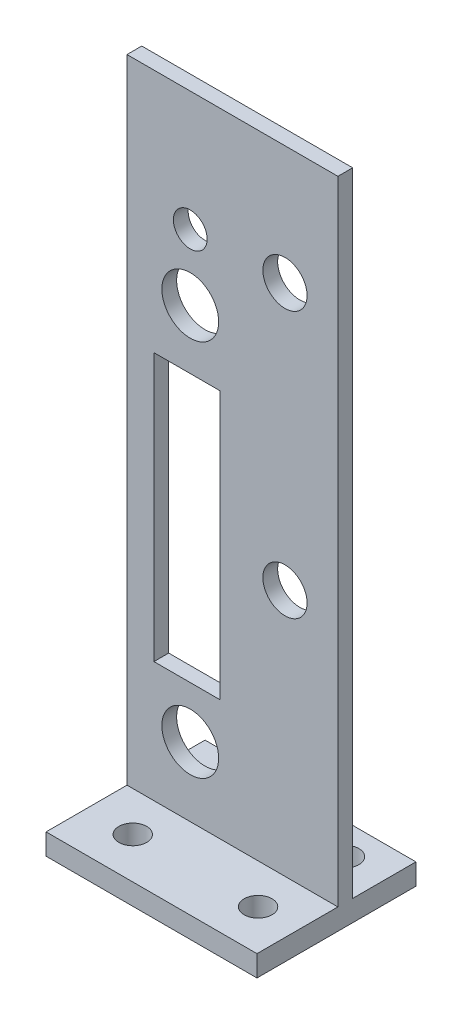
ISO-10303-21;
HEADER;
FILE_DESCRIPTION(('STEP AP214'),'2;1');
FILE_NAME('part.step','',(''),(''),'','','');
FILE_SCHEMA(('AUTOMOTIVE_DESIGN { 1 0 10303 214 1 1 1 1 }'));
ENDSEC;
DATA;
#1=APPLICATION_CONTEXT('core data for automotive mechanical design processes');
#2=APPLICATION_PROTOCOL_DEFINITION('international standard','automotive_design',2000,#1);
#3=PRODUCT_CONTEXT('',#1,'mechanical');
#4=PRODUCT('Part','Part','',(#3));
#5=PRODUCT_RELATED_PRODUCT_CATEGORY('part','',(#4));
#6=PRODUCT_DEFINITION_FORMATION('','',#4);
#7=PRODUCT_DEFINITION_CONTEXT('part definition',#1,'design');
#8=PRODUCT_DEFINITION('design','',#6,#7);
#9=PRODUCT_DEFINITION_SHAPE('','',#8);
#10=(LENGTH_UNIT() NAMED_UNIT(*) SI_UNIT(.MILLI.,.METRE.));
#11=(NAMED_UNIT(*) PLANE_ANGLE_UNIT() SI_UNIT($,.RADIAN.));
#12=(NAMED_UNIT(*) SI_UNIT($,.STERADIAN.) SOLID_ANGLE_UNIT());
#13=UNCERTAINTY_MEASURE_WITH_UNIT(LENGTH_MEASURE(1.E-05),#10,'distance_accuracy_value','');
#14=(GEOMETRIC_REPRESENTATION_CONTEXT(3) GLOBAL_UNCERTAINTY_ASSIGNED_CONTEXT((#13)) GLOBAL_UNIT_ASSIGNED_CONTEXT((#10,
#11,#12)) REPRESENTATION_CONTEXT('',''));
#15=CARTESIAN_POINT('',(0.,0.,0.));
#16=DIRECTION('',(0.,0.,1.));
#17=DIRECTION('',(1.,0.,0.));
#18=AXIS2_PLACEMENT_3D('',#15,#16,#17);
#19=CARTESIAN_POINT('',(-23.321554770318,41.8114649543858,3.5));
#20=DIRECTION('',(1.,0.,0.));
#21=DIRECTION('',(0.,1.,0.));
#22=AXIS2_PLACEMENT_3D('',#19,#20,#21);
#23=PLANE('',#22);
#24=DIRECTION('',(0.,-1.,0.));
#25=VECTOR('',#24,1.);
#26=CARTESIAN_POINT('',(-23.321554770318,41.8114649543858,0.));
#27=LINE('',#26,#25);
#28=CARTESIAN_POINT('',(-23.321554770318,41.8114649543858,0.));
#29=VERTEX_POINT('',#28);
#30=CARTESIAN_POINT('',(-23.321554770318,-108.188535045614,0.));
#31=VERTEX_POINT('',#30);
#32=EDGE_CURVE('E255',#29,#31,#27,.T.);
#33=ORIENTED_EDGE('',*,*,#32,.T.);
#34=DIRECTION('',(0.,0.,-1.));
#35=VECTOR('',#34,1.);
#36=CARTESIAN_POINT('',(-23.321554770318,-108.188535045614,0.));
#37=LINE('',#36,#35);
#38=CARTESIAN_POINT('',(-23.321554770318,-108.188535045614,-15.));
#39=VERTEX_POINT('',#38);
#40=EDGE_CURVE('E237',#31,#39,#37,.T.);
#41=ORIENTED_EDGE('',*,*,#40,.T.);
#42=DIRECTION('',(0.,1.,0.));
#43=VECTOR('',#42,1.);
#44=CARTESIAN_POINT('',(-23.321554770318,-113.188535045614,-15.));
#45=LINE('',#44,#43);
#46=CARTESIAN_POINT('',(-23.321554770318,-113.188535045614,-15.));
#47=VERTEX_POINT('',#46);
#48=EDGE_CURVE('E224',#47,#39,#45,.T.);
#49=ORIENTED_EDGE('',*,*,#48,.F.);
#50=DIRECTION('',(0.,0.,-1.));
#51=VECTOR('',#50,1.);
#52=CARTESIAN_POINT('',(-23.321554770318,-113.188535045614,0.));
#53=LINE('',#52,#51);
#54=CARTESIAN_POINT('',(-23.321554770318,-113.188535045614,22.6854790811748));
#55=VERTEX_POINT('',#54);
#56=EDGE_CURVE('E221',#55,#47,#53,.T.);
#57=ORIENTED_EDGE('',*,*,#56,.F.);
#58=DIRECTION('',(0.,1.,0.));
#59=VECTOR('',#58,1.);
#60=CARTESIAN_POINT('',(-23.321554770318,-113.188535045614,22.6854790811748));
#61=LINE('',#60,#59);
#62=CARTESIAN_POINT('',(-23.321554770318,-108.188535045614,22.6854790811748));
#63=VERTEX_POINT('',#62);
#64=EDGE_CURVE('E244',#55,#63,#61,.T.);
#65=ORIENTED_EDGE('',*,*,#64,.T.);
#66=CARTESIAN_POINT('',(-23.321554770318,-108.188535045614,3.5));
#67=VERTEX_POINT('',#66);
#68=EDGE_CURVE('E214',#63,#67,#37,.T.);
#69=ORIENTED_EDGE('',*,*,#68,.T.);
#70=DIRECTION('',(0.,-1.,0.));
#71=VECTOR('',#70,1.);
#72=CARTESIAN_POINT('',(-23.321554770318,41.8114649543858,3.5));
#73=LINE('',#72,#71);
#74=CARTESIAN_POINT('',(-23.321554770318,41.8114649543858,3.5));
#75=VERTEX_POINT('',#74);
#76=EDGE_CURVE('E256',#75,#67,#73,.T.);
#77=ORIENTED_EDGE('',*,*,#76,.F.);
#78=DIRECTION('',(0.,0.,-1.));
#79=VECTOR('',#78,1.);
#80=CARTESIAN_POINT('',(-23.321554770318,41.8114649543858,3.5));
#81=LINE('',#80,#79);
#82=EDGE_CURVE('E271',#75,#29,#81,.T.);
#83=ORIENTED_EDGE('',*,*,#82,.T.);
#84=EDGE_LOOP('',(#33,#41,#49,#57,#65,#69,#77,#83));
#85=FACE_BOUND('',#84,.T.);
#86=ADVANCED_FACE('F47',(#85),#23,.F.);
#87=CARTESIAN_POINT('',(26.678445229682,41.8114649543858,3.5));
#88=DIRECTION('',(-1.,0.,0.));
#89=DIRECTION('',(0.,-1.,0.));
#90=AXIS2_PLACEMENT_3D('',#87,#88,#89);
#91=PLANE('',#90);
#92=DIRECTION('',(0.,1.,0.));
#93=VECTOR('',#92,1.);
#94=CARTESIAN_POINT('',(26.678445229682,41.8114649543858,0.));
#95=LINE('',#94,#93);
#96=CARTESIAN_POINT('',(26.678445229682,-108.188535045614,0.));
#97=VERTEX_POINT('',#96);
#98=CARTESIAN_POINT('',(26.678445229682,41.8114649543858,0.));
#99=VERTEX_POINT('',#98);
#100=EDGE_CURVE('E278',#97,#99,#95,.T.);
#101=ORIENTED_EDGE('',*,*,#100,.T.);
#102=DIRECTION('',(0.,0.,-1.));
#103=VECTOR('',#102,1.);
#104=CARTESIAN_POINT('',(26.678445229682,41.8114649543858,3.5));
#105=LINE('',#104,#103);
#106=CARTESIAN_POINT('',(26.678445229682,41.8114649543858,3.5));
#107=VERTEX_POINT('',#106);
#108=EDGE_CURVE('E286',#107,#99,#105,.T.);
#109=ORIENTED_EDGE('',*,*,#108,.F.);
#110=DIRECTION('',(0.,1.,0.));
#111=VECTOR('',#110,1.);
#112=CARTESIAN_POINT('',(26.678445229682,41.8114649543858,3.5));
#113=LINE('',#112,#111);
#114=CARTESIAN_POINT('',(26.678445229682,-108.188535045614,3.5));
#115=VERTEX_POINT('',#114);
#116=EDGE_CURVE('E265',#115,#107,#113,.T.);
#117=ORIENTED_EDGE('',*,*,#116,.F.);
#118=DIRECTION('',(0.,0.,1.));
#119=VECTOR('',#118,1.);
#120=CARTESIAN_POINT('',(26.678445229682,-108.188535045614,0.));
#121=LINE('',#120,#119);
#122=CARTESIAN_POINT('',(26.678445229682,-108.188535045614,22.6854790811748));
#123=VERTEX_POINT('',#122);
#124=EDGE_CURVE('E228',#115,#123,#121,.T.);
#125=ORIENTED_EDGE('',*,*,#124,.T.);
#126=DIRECTION('',(0.,1.,0.));
#127=VECTOR('',#126,1.);
#128=CARTESIAN_POINT('',(26.678445229682,-113.188535045614,22.6854790811748));
#129=LINE('',#128,#127);
#130=CARTESIAN_POINT('',(26.678445229682,-113.188535045614,22.6854790811748));
#131=VERTEX_POINT('',#130);
#132=EDGE_CURVE('E247',#131,#123,#129,.T.);
#133=ORIENTED_EDGE('',*,*,#132,.F.);
#134=DIRECTION('',(0.,0.,1.));
#135=VECTOR('',#134,1.);
#136=CARTESIAN_POINT('',(26.678445229682,-113.188535045614,0.));
#137=LINE('',#136,#135);
#138=CARTESIAN_POINT('',(26.678445229682,-113.188535045614,-15.));
#139=VERTEX_POINT('',#138);
#140=EDGE_CURVE('E213',#139,#131,#137,.T.);
#141=ORIENTED_EDGE('',*,*,#140,.F.);
#142=DIRECTION('',(0.,1.,0.));
#143=VECTOR('',#142,1.);
#144=CARTESIAN_POINT('',(26.678445229682,-113.188535045614,-15.));
#145=LINE('',#144,#143);
#146=CARTESIAN_POINT('',(26.678445229682,-108.188535045614,-15.));
#147=VERTEX_POINT('',#146);
#148=EDGE_CURVE('E251',#139,#147,#145,.T.);
#149=ORIENTED_EDGE('',*,*,#148,.T.);
#150=EDGE_CURVE('E229',#147,#97,#121,.T.);
#151=ORIENTED_EDGE('',*,*,#150,.T.);
#152=EDGE_LOOP('',(#101,#109,#117,#125,#133,#141,#149,#151));
#153=FACE_BOUND('',#152,.T.);
#154=ADVANCED_FACE('F363',(#153),#91,.F.);
#155=CARTESIAN_POINT('',(-23.321554770318,41.8114649543858,3.5));
#156=DIRECTION('',(0.,-1.,0.));
#157=DIRECTION('',(0.,0.,-1.));
#158=AXIS2_PLACEMENT_3D('',#155,#156,#157);
#159=PLANE('',#158);
#160=DIRECTION('',(-1.,0.,0.));
#161=VECTOR('',#160,1.);
#162=CARTESIAN_POINT('',(-23.321554770318,41.8114649543858,0.));
#163=LINE('',#162,#161);
#164=EDGE_CURVE('E261',#99,#29,#163,.T.);
#165=ORIENTED_EDGE('',*,*,#164,.T.);
#166=ORIENTED_EDGE('',*,*,#82,.F.);
#167=DIRECTION('',(-1.,0.,0.));
#168=VECTOR('',#167,1.);
#169=CARTESIAN_POINT('',(-23.321554770318,41.8114649543858,3.5));
#170=LINE('',#169,#168);
#171=EDGE_CURVE('E268',#107,#75,#170,.T.);
#172=ORIENTED_EDGE('',*,*,#171,.F.);
#173=ORIENTED_EDGE('',*,*,#108,.T.);
#174=EDGE_LOOP('',(#165,#166,#172,#173));
#175=FACE_BOUND('',#174,.T.);
#176=ADVANCED_FACE('F359',(#175),#159,.F.);
#177=CARTESIAN_POINT('',(0.,0.,3.5));
#178=DIRECTION('',(0.,0.,1.));
#179=DIRECTION('',(1.,0.,0.));
#180=AXIS2_PLACEMENT_3D('',#177,#178,#179);
#181=PLANE('',#180);
#182=CARTESIAN_POINT('',(14.135684742779,13.6491774901224,3.5));
#183=DIRECTION('',(0.,0.,1.));
#184=DIRECTION('',(1.,0.,0.));
#185=AXIS2_PLACEMENT_3D('',#182,#183,#184);
#186=CIRCLE('',#185,5.24);
#187=CARTESIAN_POINT('',(19.375684742779,13.6491774901224,3.5));
#188=VERTEX_POINT('',#187);
#189=EDGE_CURVE('E313',#188,#188,#186,.T.);
#190=ORIENTED_EDGE('',*,*,#189,.F.);
#191=EDGE_LOOP('',(#190));
#192=FACE_BOUND('',#191,.T.);
#193=CARTESIAN_POINT('',(14.135684742779,-49.4627558763849,3.5));
#194=DIRECTION('',(0.,0.,1.));
#195=DIRECTION('',(1.,0.,0.));
#196=AXIS2_PLACEMENT_3D('',#193,#194,#195);
#197=CIRCLE('',#196,5.24);
#198=CARTESIAN_POINT('',(19.375684742779,-49.4627558763849,3.5));
#199=VERTEX_POINT('',#198);
#200=EDGE_CURVE('E320',#199,#199,#197,.T.);
#201=ORIENTED_EDGE('',*,*,#200,.F.);
#202=EDGE_LOOP('',(#201));
#203=FACE_BOUND('',#202,.T.);
#204=CARTESIAN_POINT('',(-8.32155477031803,-91.8029962411796,3.5));
#205=DIRECTION('',(0.,0.,1.));
#206=DIRECTION('',(1.,0.,0.));
#207=AXIS2_PLACEMENT_3D('',#204,#205,#206);
#208=CIRCLE('',#207,6.731);
#209=CARTESIAN_POINT('',(-1.59055477031803,-91.8029962411796,3.5));
#210=VERTEX_POINT('',#209);
#211=EDGE_CURVE('E167',#210,#210,#208,.T.);
#212=ORIENTED_EDGE('',*,*,#211,.F.);
#213=EDGE_LOOP('',(#212));
#214=FACE_BOUND('',#213,.T.);
#215=CARTESIAN_POINT('',(-8.32155477031803,-2.20299624117957,3.5));
#216=DIRECTION('',(0.,0.,1.));
#217=DIRECTION('',(1.,0.,0.));
#218=AXIS2_PLACEMENT_3D('',#215,#216,#217);
#219=CIRCLE('',#218,6.731);
#220=CARTESIAN_POINT('',(-1.59055477031803,-2.20299624117957,3.5));
#221=VERTEX_POINT('',#220);
#222=EDGE_CURVE('E162',#221,#221,#219,.T.);
#223=ORIENTED_EDGE('',*,*,#222,.F.);
#224=EDGE_LOOP('',(#223));
#225=FACE_BOUND('',#224,.T.);
#226=DIRECTION('',(0.,-1.,0.));
#227=VECTOR('',#226,1.);
#228=CARTESIAN_POINT('',(-16.9306567073099,-16.1959114515281,3.5));
#229=LINE('',#228,#227);
#230=CARTESIAN_POINT('',(-16.9306567073099,-16.1959114515281,3.5));
#231=VERTEX_POINT('',#230);
#232=CARTESIAN_POINT('',(-16.9306567073099,-79.6261951335017,3.5));
#233=VERTEX_POINT('',#232);
#234=EDGE_CURVE('E64',#231,#233,#229,.T.);
#235=ORIENTED_EDGE('',*,*,#234,.F.);
#236=DIRECTION('',(-1.,0.,0.));
#237=VECTOR('',#236,1.);
#238=CARTESIAN_POINT('',(-16.9306567073099,-16.1959114515281,3.5));
#239=LINE('',#238,#237);
#240=CARTESIAN_POINT('',(-1.24340443109602,-16.1959114515281,3.5));
#241=VERTEX_POINT('',#240);
#242=EDGE_CURVE('E147',#241,#231,#239,.T.);
#243=ORIENTED_EDGE('',*,*,#242,.F.);
#244=DIRECTION('',(0.,1.,0.));
#245=VECTOR('',#244,1.);
#246=CARTESIAN_POINT('',(-1.24340443109602,-16.1959114515281,3.5));
#247=LINE('',#246,#245);
#248=CARTESIAN_POINT('',(-1.24340443109602,-79.6261951335017,3.5));
#249=VERTEX_POINT('',#248);
#250=EDGE_CURVE('E154',#249,#241,#247,.T.);
#251=ORIENTED_EDGE('',*,*,#250,.F.);
#252=DIRECTION('',(1.,0.,0.));
#253=VECTOR('',#252,1.);
#254=CARTESIAN_POINT('',(-16.9306567073099,-79.6261951335017,3.5));
#255=LINE('',#254,#253);
#256=EDGE_CURVE('E160',#233,#249,#255,.T.);
#257=ORIENTED_EDGE('',*,*,#256,.F.);
#258=EDGE_LOOP('',(#235,#243,#251,#257));
#259=FACE_BOUND('',#258,.T.);
#260=CARTESIAN_POINT('',(-8.32155477031803,13.3970037588204,3.5));
#261=DIRECTION('',(0.,0.,1.));
#262=DIRECTION('',(1.,0.,0.));
#263=AXIS2_PLACEMENT_3D('',#260,#261,#262);
#264=CIRCLE('',#263,4.);
#265=CARTESIAN_POINT('',(-4.32155477031803,13.3970037588204,3.5));
#266=VERTEX_POINT('',#265);
#267=EDGE_CURVE('E144',#266,#266,#264,.T.);
#268=ORIENTED_EDGE('',*,*,#267,.F.);
#269=EDGE_LOOP('',(#268));
#270=FACE_BOUND('',#269,.T.);
#271=ORIENTED_EDGE('',*,*,#76,.T.);
#272=DIRECTION('',(1.,0.,0.));
#273=VECTOR('',#272,1.);
#274=CARTESIAN_POINT('',(-23.321554770318,-108.188535045614,3.5));
#275=LINE('',#274,#273);
#276=EDGE_CURVE('E260',#67,#115,#275,.T.);
#277=ORIENTED_EDGE('',*,*,#276,.T.);
#278=ORIENTED_EDGE('',*,*,#116,.T.);
#279=ORIENTED_EDGE('',*,*,#171,.T.);
#280=EDGE_LOOP('',(#271,#277,#278,#279));
#281=FACE_BOUND('',#280,.T.);
#282=ADVANCED_FACE('F158',(#192,#203,#214,#225,#259,#270,#281),#181,.T.);
#283=CARTESIAN_POINT('',(0.,0.,0.));
#284=DIRECTION('',(0.,0.,1.));
#285=DIRECTION('',(1.,0.,0.));
#286=AXIS2_PLACEMENT_3D('',#283,#284,#285);
#287=PLANE('',#286);
#288=CARTESIAN_POINT('',(14.135684742779,13.6491774901224,0.));
#289=DIRECTION('',(0.,0.,1.));
#290=DIRECTION('',(1.,0.,0.));
#291=AXIS2_PLACEMENT_3D('',#288,#289,#290);
#292=CIRCLE('',#291,5.24);
#293=CARTESIAN_POINT('',(19.375684742779,13.6491774901224,0.));
#294=VERTEX_POINT('',#293);
#295=EDGE_CURVE('E50',#294,#294,#292,.T.);
#296=ORIENTED_EDGE('',*,*,#295,.T.);
#297=EDGE_LOOP('',(#296));
#298=FACE_BOUND('',#297,.T.);
#299=CARTESIAN_POINT('',(14.135684742779,-49.4627558763849,0.));
#300=DIRECTION('',(0.,0.,1.));
#301=DIRECTION('',(1.,0.,0.));
#302=AXIS2_PLACEMENT_3D('',#299,#300,#301);
#303=CIRCLE('',#302,5.24);
#304=CARTESIAN_POINT('',(19.375684742779,-49.4627558763849,0.));
#305=VERTEX_POINT('',#304);
#306=EDGE_CURVE('E310',#305,#305,#303,.T.);
#307=ORIENTED_EDGE('',*,*,#306,.T.);
#308=EDGE_LOOP('',(#307));
#309=FACE_BOUND('',#308,.T.);
#310=CARTESIAN_POINT('',(-8.32155477031803,-91.8029962411796,0.));
#311=DIRECTION('',(0.,0.,1.));
#312=DIRECTION('',(1.,0.,0.));
#313=AXIS2_PLACEMENT_3D('',#310,#311,#312);
#314=CIRCLE('',#313,6.731);
#315=CARTESIAN_POINT('',(-1.59055477031803,-91.8029962411796,0.));
#316=VERTEX_POINT('',#315);
#317=EDGE_CURVE('E184',#316,#316,#314,.T.);
#318=ORIENTED_EDGE('',*,*,#317,.T.);
#319=EDGE_LOOP('',(#318));
#320=FACE_BOUND('',#319,.T.);
#321=CARTESIAN_POINT('',(-8.32155477031803,-2.20299624117957,0.));
#322=DIRECTION('',(0.,0.,1.));
#323=DIRECTION('',(1.,0.,0.));
#324=AXIS2_PLACEMENT_3D('',#321,#322,#323);
#325=CIRCLE('',#324,6.731);
#326=CARTESIAN_POINT('',(-1.59055477031803,-2.20299624117957,0.));
#327=VERTEX_POINT('',#326);
#328=EDGE_CURVE('E295',#327,#327,#325,.T.);
#329=ORIENTED_EDGE('',*,*,#328,.T.);
#330=EDGE_LOOP('',(#329));
#331=FACE_BOUND('',#330,.T.);
#332=DIRECTION('',(-1.,0.,0.));
#333=VECTOR('',#332,1.);
#334=CARTESIAN_POINT('',(0.,-16.1959114515281,0.));
#335=LINE('',#334,#333);
#336=CARTESIAN_POINT('',(-1.24340443109602,-16.1959114515281,0.));
#337=VERTEX_POINT('',#336);
#338=CARTESIAN_POINT('',(-16.9306567073099,-16.1959114515281,0.));
#339=VERTEX_POINT('',#338);
#340=EDGE_CURVE('E56',#337,#339,#335,.T.);
#341=ORIENTED_EDGE('',*,*,#340,.T.);
#342=DIRECTION('',(0.,-1.,0.));
#343=VECTOR('',#342,1.);
#344=CARTESIAN_POINT('',(-16.9306567073099,0.,0.));
#345=LINE('',#344,#343);
#346=CARTESIAN_POINT('',(-16.9306567073099,-79.6261951335017,0.));
#347=VERTEX_POINT('',#346);
#348=EDGE_CURVE('E11',#339,#347,#345,.T.);
#349=ORIENTED_EDGE('',*,*,#348,.T.);
#350=DIRECTION('',(1.,0.,0.));
#351=VECTOR('',#350,1.);
#352=CARTESIAN_POINT('',(0.,-79.6261951335017,0.));
#353=LINE('',#352,#351);
#354=CARTESIAN_POINT('',(-1.24340443109602,-79.6261951335017,0.));
#355=VERTEX_POINT('',#354);
#356=EDGE_CURVE('E290',#347,#355,#353,.T.);
#357=ORIENTED_EDGE('',*,*,#356,.T.);
#358=DIRECTION('',(0.,1.,0.));
#359=VECTOR('',#358,1.);
#360=CARTESIAN_POINT('',(-1.24340443109603,0.,0.));
#361=LINE('',#360,#359);
#362=EDGE_CURVE('E299',#355,#337,#361,.T.);
#363=ORIENTED_EDGE('',*,*,#362,.T.);
#364=EDGE_LOOP('',(#341,#349,#357,#363));
#365=FACE_BOUND('',#364,.T.);
#366=CARTESIAN_POINT('',(-8.32155477031803,13.3970037588204,0.));
#367=DIRECTION('',(0.,0.,1.));
#368=DIRECTION('',(1.,0.,0.));
#369=AXIS2_PLACEMENT_3D('',#366,#367,#368);
#370=CIRCLE('',#369,4.);
#371=CARTESIAN_POINT('',(-4.32155477031803,13.3970037588204,0.));
#372=VERTEX_POINT('',#371);
#373=EDGE_CURVE('E291',#372,#372,#370,.T.);
#374=ORIENTED_EDGE('',*,*,#373,.T.);
#375=EDGE_LOOP('',(#374));
#376=FACE_BOUND('',#375,.T.);
#377=ORIENTED_EDGE('',*,*,#32,.F.);
#378=ORIENTED_EDGE('',*,*,#164,.F.);
#379=ORIENTED_EDGE('',*,*,#100,.F.);
#380=DIRECTION('',(1.,0.,0.));
#381=VECTOR('',#380,1.);
#382=CARTESIAN_POINT('',(-23.321554770318,-108.188535045614,0.));
#383=LINE('',#382,#381);
#384=EDGE_CURVE('E275',#31,#97,#383,.T.);
#385=ORIENTED_EDGE('',*,*,#384,.F.);
#386=EDGE_LOOP('',(#377,#378,#379,#385));
#387=FACE_BOUND('',#386,.T.);
#388=ADVANCED_FACE('F341',(#298,#309,#320,#331,#365,#376,#387),#287,.F.);
#389=CARTESIAN_POINT('',(0.,-108.188535045614,0.));
#390=DIRECTION('',(0.,-1.,0.));
#391=DIRECTION('',(0.,0.,-1.));
#392=AXIS2_PLACEMENT_3D('',#389,#390,#391);
#393=PLANE('',#392);
#394=CARTESIAN_POINT('',(17.1873360331385,-108.188535045614,-7.67214474571343));
#395=DIRECTION('',(0.,1.,0.));
#396=DIRECTION('',(0.,0.,1.));
#397=AXIS2_PLACEMENT_3D('',#394,#395,#396);
#398=CIRCLE('',#397,3.302);
#399=CARTESIAN_POINT('',(17.1873360331385,-108.188535045614,-4.37014474571343));
#400=VERTEX_POINT('',#399);
#401=EDGE_CURVE('E185',#400,#400,#398,.T.);
#402=ORIENTED_EDGE('',*,*,#401,.F.);
#403=EDGE_LOOP('',(#402));
#404=FACE_BOUND('',#403,.T.);
#405=CARTESIAN_POINT('',(-12.5224668313144,-108.188535045614,-7.67214474571343));
#406=DIRECTION('',(0.,1.,0.));
#407=DIRECTION('',(0.,0.,1.));
#408=AXIS2_PLACEMENT_3D('',#405,#406,#407);
#409=CIRCLE('',#408,3.302);
#410=CARTESIAN_POINT('',(-12.5224668313144,-108.188535045614,-4.37014474571343));
#411=VERTEX_POINT('',#410);
#412=EDGE_CURVE('E189',#411,#411,#409,.T.);
#413=ORIENTED_EDGE('',*,*,#412,.F.);
#414=EDGE_LOOP('',(#413));
#415=FACE_BOUND('',#414,.T.);
#416=ORIENTED_EDGE('',*,*,#40,.F.);
#417=ORIENTED_EDGE('',*,*,#384,.T.);
#418=ORIENTED_EDGE('',*,*,#150,.F.);
#419=DIRECTION('',(1.,0.,0.));
#420=VECTOR('',#419,1.);
#421=CARTESIAN_POINT('',(0.,-108.188535045614,-15.));
#422=LINE('',#421,#420);
#423=EDGE_CURVE('E205',#39,#147,#422,.T.);
#424=ORIENTED_EDGE('',*,*,#423,.F.);
#425=EDGE_LOOP('',(#416,#417,#418,#424));
#426=FACE_BOUND('',#425,.T.);
#427=ADVANCED_FACE('F344',(#404,#415,#426),#393,.F.);
#428=CARTESIAN_POINT('',(0.,-113.188535045614,-15.));
#429=DIRECTION('',(0.,0.,1.));
#430=DIRECTION('',(1.,0.,0.));
#431=AXIS2_PLACEMENT_3D('',#428,#429,#430);
#432=PLANE('',#431);
#433=ORIENTED_EDGE('',*,*,#423,.T.);
#434=ORIENTED_EDGE('',*,*,#148,.F.);
#435=DIRECTION('',(1.,0.,0.));
#436=VECTOR('',#435,1.);
#437=CARTESIAN_POINT('',(0.,-113.188535045614,-15.));
#438=LINE('',#437,#436);
#439=EDGE_CURVE('E209',#47,#139,#438,.T.);
#440=ORIENTED_EDGE('',*,*,#439,.F.);
#441=ORIENTED_EDGE('',*,*,#48,.T.);
#442=EDGE_LOOP('',(#433,#434,#440,#441));
#443=FACE_BOUND('',#442,.T.);
#444=ADVANCED_FACE('F400',(#443),#432,.F.);
#445=CARTESIAN_POINT('',(0.,-113.188535045614,22.6854790811748));
#446=DIRECTION('',(0.,0.,1.));
#447=DIRECTION('',(1.,0.,0.));
#448=AXIS2_PLACEMENT_3D('',#445,#446,#447);
#449=PLANE('',#448);
#450=DIRECTION('',(1.,0.,0.));
#451=VECTOR('',#450,1.);
#452=CARTESIAN_POINT('',(0.,-108.188535045614,22.6854790811748));
#453=LINE('',#452,#451);
#454=EDGE_CURVE('E233',#63,#123,#453,.T.);
#455=ORIENTED_EDGE('',*,*,#454,.F.);
#456=ORIENTED_EDGE('',*,*,#64,.F.);
#457=DIRECTION('',(1.,0.,0.));
#458=VECTOR('',#457,1.);
#459=CARTESIAN_POINT('',(0.,-113.188535045614,22.6854790811748));
#460=LINE('',#459,#458);
#461=EDGE_CURVE('E217',#55,#131,#460,.T.);
#462=ORIENTED_EDGE('',*,*,#461,.T.);
#463=ORIENTED_EDGE('',*,*,#132,.T.);
#464=EDGE_LOOP('',(#455,#456,#462,#463));
#465=FACE_BOUND('',#464,.T.);
#466=ADVANCED_FACE('F373',(#465),#449,.T.);
#467=CARTESIAN_POINT('',(0.,-113.188535045614,0.));
#468=DIRECTION('',(0.,-1.,0.));
#469=DIRECTION('',(0.,0.,-1.));
#470=AXIS2_PLACEMENT_3D('',#467,#468,#469);
#471=PLANE('',#470);
#472=CARTESIAN_POINT('',(17.1873360331385,-113.188535045614,-7.67214474571343));
#473=DIRECTION('',(0.,1.,0.));
#474=DIRECTION('',(0.,0.,1.));
#475=AXIS2_PLACEMENT_3D('',#472,#473,#474);
#476=CIRCLE('',#475,3.302);
#477=CARTESIAN_POINT('',(17.1873360331385,-113.188535045614,-4.37014474571343));
#478=VERTEX_POINT('',#477);
#479=EDGE_CURVE('E190',#478,#478,#476,.T.);
#480=ORIENTED_EDGE('',*,*,#479,.T.);
#481=EDGE_LOOP('',(#480));
#482=FACE_BOUND('',#481,.T.);
#483=CARTESIAN_POINT('',(-12.5224668313144,-113.188535045614,12.9285204480345));
#484=DIRECTION('',(0.,1.,0.));
#485=DIRECTION('',(0.,0.,1.));
#486=AXIS2_PLACEMENT_3D('',#483,#484,#485);
#487=CIRCLE('',#486,3.302);
#488=CARTESIAN_POINT('',(-12.5224668313144,-113.188535045614,16.2305204480345));
#489=VERTEX_POINT('',#488);
#490=EDGE_CURVE('E179',#489,#489,#487,.T.);
#491=ORIENTED_EDGE('',*,*,#490,.T.);
#492=EDGE_LOOP('',(#491));
#493=FACE_BOUND('',#492,.T.);
#494=CARTESIAN_POINT('',(17.1873360331385,-113.188535045614,12.9285204480345));
#495=DIRECTION('',(0.,1.,0.));
#496=DIRECTION('',(0.,0.,1.));
#497=AXIS2_PLACEMENT_3D('',#494,#495,#496);
#498=CIRCLE('',#497,3.302);
#499=CARTESIAN_POINT('',(17.1873360331385,-113.188535045614,16.2305204480345));
#500=VERTEX_POINT('',#499);
#501=EDGE_CURVE('E180',#500,#500,#498,.T.);
#502=ORIENTED_EDGE('',*,*,#501,.T.);
#503=EDGE_LOOP('',(#502));
#504=FACE_BOUND('',#503,.T.);
#505=CARTESIAN_POINT('',(-12.5224668313144,-113.188535045614,-7.67214474571343));
#506=DIRECTION('',(0.,1.,0.));
#507=DIRECTION('',(0.,0.,1.));
#508=AXIS2_PLACEMENT_3D('',#505,#506,#507);
#509=CIRCLE('',#508,3.302);
#510=CARTESIAN_POINT('',(-12.5224668313144,-113.188535045614,-4.37014474571343));
#511=VERTEX_POINT('',#510);
#512=EDGE_CURVE('E201',#511,#511,#509,.T.);
#513=ORIENTED_EDGE('',*,*,#512,.T.);
#514=EDGE_LOOP('',(#513));
#515=FACE_BOUND('',#514,.T.);
#516=ORIENTED_EDGE('',*,*,#439,.T.);
#517=ORIENTED_EDGE('',*,*,#140,.T.);
#518=ORIENTED_EDGE('',*,*,#461,.F.);
#519=ORIENTED_EDGE('',*,*,#56,.T.);
#520=EDGE_LOOP('',(#516,#517,#518,#519));
#521=FACE_BOUND('',#520,.T.);
#522=ADVANCED_FACE('F412',(#482,#493,#504,#515,#521),#471,.T.);
#523=CARTESIAN_POINT('',(-12.5224668313144,-108.188535045614,12.9285204480345));
#524=DIRECTION('',(0.,1.,0.));
#525=DIRECTION('',(0.,0.,1.));
#526=AXIS2_PLACEMENT_3D('',#523,#524,#525);
#527=CIRCLE('',#526,3.302);
#528=CARTESIAN_POINT('',(-12.5224668313144,-108.188535045614,16.2305204480345));
#529=VERTEX_POINT('',#528);
#530=EDGE_CURVE('E194',#529,#529,#527,.T.);
#531=ORIENTED_EDGE('',*,*,#530,.F.);
#532=EDGE_LOOP('',(#531));
#533=FACE_BOUND('',#532,.T.);
#534=CARTESIAN_POINT('',(17.1873360331385,-108.188535045614,12.9285204480345));
#535=DIRECTION('',(0.,1.,0.));
#536=DIRECTION('',(0.,0.,1.));
#537=AXIS2_PLACEMENT_3D('',#534,#535,#536);
#538=CIRCLE('',#537,3.302);
#539=CARTESIAN_POINT('',(17.1873360331385,-108.188535045614,16.2305204480345));
#540=VERTEX_POINT('',#539);
#541=EDGE_CURVE('E175',#540,#540,#538,.T.);
#542=ORIENTED_EDGE('',*,*,#541,.F.);
#543=EDGE_LOOP('',(#542));
#544=FACE_BOUND('',#543,.T.);
#545=ORIENTED_EDGE('',*,*,#276,.F.);
#546=ORIENTED_EDGE('',*,*,#68,.F.);
#547=ORIENTED_EDGE('',*,*,#454,.T.);
#548=ORIENTED_EDGE('',*,*,#124,.F.);
#549=EDGE_LOOP('',(#545,#546,#547,#548));
#550=FACE_BOUND('',#549,.T.);
#551=ADVANCED_FACE('F376',(#533,#544,#550),#393,.F.);
#552=CARTESIAN_POINT('',(17.1873360331385,-113.188535045614,12.9285204480345));
#553=DIRECTION('',(0.,1.,0.));
#554=DIRECTION('',(0.,0.,1.));
#555=AXIS2_PLACEMENT_3D('',#552,#553,#554);
#556=CYLINDRICAL_SURFACE('',#555,3.302);
#557=ORIENTED_EDGE('',*,*,#501,.F.);
#558=EDGE_LOOP('',(#557));
#559=FACE_BOUND('',#558,.T.);
#560=ORIENTED_EDGE('',*,*,#541,.T.);
#561=EDGE_LOOP('',(#560));
#562=FACE_BOUND('',#561,.T.);
#563=ADVANCED_FACE('F437',(#559,#562),#556,.F.);
#564=CARTESIAN_POINT('',(-12.5224668313144,-113.188535045614,12.9285204480345));
#565=DIRECTION('',(0.,1.,0.));
#566=DIRECTION('',(0.,0.,1.));
#567=AXIS2_PLACEMENT_3D('',#564,#565,#566);
#568=CYLINDRICAL_SURFACE('',#567,3.302);
#569=ORIENTED_EDGE('',*,*,#490,.F.);
#570=EDGE_LOOP('',(#569));
#571=FACE_BOUND('',#570,.T.);
#572=ORIENTED_EDGE('',*,*,#530,.T.);
#573=EDGE_LOOP('',(#572));
#574=FACE_BOUND('',#573,.T.);
#575=ADVANCED_FACE('F445',(#571,#574),#568,.F.);
#576=CARTESIAN_POINT('',(-12.5224668313144,-113.188535045614,-7.67214474571343));
#577=DIRECTION('',(0.,1.,0.));
#578=DIRECTION('',(0.,0.,1.));
#579=AXIS2_PLACEMENT_3D('',#576,#577,#578);
#580=CYLINDRICAL_SURFACE('',#579,3.302);
#581=ORIENTED_EDGE('',*,*,#512,.F.);
#582=EDGE_LOOP('',(#581));
#583=FACE_BOUND('',#582,.T.);
#584=ORIENTED_EDGE('',*,*,#412,.T.);
#585=EDGE_LOOP('',(#584));
#586=FACE_BOUND('',#585,.T.);
#587=ADVANCED_FACE('F454',(#583,#586),#580,.F.);
#588=CARTESIAN_POINT('',(17.1873360331385,-113.188535045614,-7.67214474571343));
#589=DIRECTION('',(0.,1.,0.));
#590=DIRECTION('',(0.,0.,1.));
#591=AXIS2_PLACEMENT_3D('',#588,#589,#590);
#592=CYLINDRICAL_SURFACE('',#591,3.302);
#593=ORIENTED_EDGE('',*,*,#479,.F.);
#594=EDGE_LOOP('',(#593));
#595=FACE_BOUND('',#594,.T.);
#596=ORIENTED_EDGE('',*,*,#401,.T.);
#597=EDGE_LOOP('',(#596));
#598=FACE_BOUND('',#597,.T.);
#599=ADVANCED_FACE('F463',(#595,#598),#592,.F.);
#600=CARTESIAN_POINT('',(-8.32155477031803,13.3970037588204,-6.5));
#601=DIRECTION('',(0.,0.,1.));
#602=DIRECTION('',(1.,0.,0.));
#603=AXIS2_PLACEMENT_3D('',#600,#601,#602);
#604=CYLINDRICAL_SURFACE('',#603,4.);
#605=ORIENTED_EDGE('',*,*,#267,.T.);
#606=EDGE_LOOP('',(#605));
#607=FACE_BOUND('',#606,.T.);
#608=ORIENTED_EDGE('',*,*,#373,.F.);
#609=EDGE_LOOP('',(#608));
#610=FACE_BOUND('',#609,.T.);
#611=ADVANCED_FACE('F472',(#607,#610),#604,.F.);
#612=CARTESIAN_POINT('',(-16.9306567073099,-16.1959114515281,-6.5));
#613=DIRECTION('',(-1.,0.,0.));
#614=DIRECTION('',(0.,-1.,0.));
#615=AXIS2_PLACEMENT_3D('',#612,#613,#614);
#616=PLANE('',#615);
#617=DIRECTION('',(0.,0.,1.));
#618=VECTOR('',#617,1.);
#619=CARTESIAN_POINT('',(-16.9306567073099,-16.1959114515281,-6.5));
#620=LINE('',#619,#618);
#621=EDGE_CURVE('E137',#339,#231,#620,.T.);
#622=ORIENTED_EDGE('',*,*,#621,.T.);
#623=ORIENTED_EDGE('',*,*,#234,.T.);
#624=DIRECTION('',(0.,0.,1.));
#625=VECTOR('',#624,1.);
#626=CARTESIAN_POINT('',(-16.9306567073099,-79.6261951335017,-6.5));
#627=LINE('',#626,#625);
#628=EDGE_CURVE('E155',#347,#233,#627,.T.);
#629=ORIENTED_EDGE('',*,*,#628,.F.);
#630=ORIENTED_EDGE('',*,*,#348,.F.);
#631=EDGE_LOOP('',(#622,#623,#629,#630));
#632=FACE_BOUND('',#631,.T.);
#633=ADVANCED_FACE('F139',(#632),#616,.F.);
#634=CARTESIAN_POINT('',(-16.9306567073099,-16.1959114515281,-6.5));
#635=DIRECTION('',(0.,1.,0.));
#636=DIRECTION('',(0.,0.,1.));
#637=AXIS2_PLACEMENT_3D('',#634,#635,#636);
#638=PLANE('',#637);
#639=DIRECTION('',(0.,0.,1.));
#640=VECTOR('',#639,1.);
#641=CARTESIAN_POINT('',(-1.24340443109602,-16.1959114515281,-6.5));
#642=LINE('',#641,#640);
#643=EDGE_CURVE('E143',#337,#241,#642,.T.);
#644=ORIENTED_EDGE('',*,*,#643,.T.);
#645=ORIENTED_EDGE('',*,*,#242,.T.);
#646=ORIENTED_EDGE('',*,*,#621,.F.);
#647=ORIENTED_EDGE('',*,*,#340,.F.);
#648=EDGE_LOOP('',(#644,#645,#646,#647));
#649=FACE_BOUND('',#648,.T.);
#650=ADVANCED_FACE('F148',(#649),#638,.F.);
#651=CARTESIAN_POINT('',(-1.24340443109602,-16.1959114515281,-6.5));
#652=DIRECTION('',(1.,0.,0.));
#653=DIRECTION('',(0.,1.,0.));
#654=AXIS2_PLACEMENT_3D('',#651,#652,#653);
#655=PLANE('',#654);
#656=DIRECTION('',(0.,0.,1.));
#657=VECTOR('',#656,1.);
#658=CARTESIAN_POINT('',(-1.24340443109602,-79.6261951335017,-6.5));
#659=LINE('',#658,#657);
#660=EDGE_CURVE('E72',#355,#249,#659,.T.);
#661=ORIENTED_EDGE('',*,*,#660,.T.);
#662=ORIENTED_EDGE('',*,*,#250,.T.);
#663=ORIENTED_EDGE('',*,*,#643,.F.);
#664=ORIENTED_EDGE('',*,*,#362,.F.);
#665=EDGE_LOOP('',(#661,#662,#663,#664));
#666=FACE_BOUND('',#665,.T.);
#667=ADVANCED_FACE('F338',(#666),#655,.F.);
#668=CARTESIAN_POINT('',(-16.9306567073099,-79.6261951335017,-6.5));
#669=DIRECTION('',(0.,-1.,0.));
#670=DIRECTION('',(0.,0.,-1.));
#671=AXIS2_PLACEMENT_3D('',#668,#669,#670);
#672=PLANE('',#671);
#673=ORIENTED_EDGE('',*,*,#628,.T.);
#674=ORIENTED_EDGE('',*,*,#256,.T.);
#675=ORIENTED_EDGE('',*,*,#660,.F.);
#676=ORIENTED_EDGE('',*,*,#356,.F.);
#677=EDGE_LOOP('',(#673,#674,#675,#676));
#678=FACE_BOUND('',#677,.T.);
#679=ADVANCED_FACE('F339',(#678),#672,.F.);
#680=CARTESIAN_POINT('',(-8.32155477031803,-2.20299624117957,-6.5));
#681=DIRECTION('',(0.,0.,1.));
#682=DIRECTION('',(1.,0.,0.));
#683=AXIS2_PLACEMENT_3D('',#680,#681,#682);
#684=CYLINDRICAL_SURFACE('',#683,6.731);
#685=ORIENTED_EDGE('',*,*,#222,.T.);
#686=EDGE_LOOP('',(#685));
#687=FACE_BOUND('',#686,.T.);
#688=ORIENTED_EDGE('',*,*,#328,.F.);
#689=EDGE_LOOP('',(#688));
#690=FACE_BOUND('',#689,.T.);
#691=ADVANCED_FACE('F510',(#687,#690),#684,.F.);
#692=CARTESIAN_POINT('',(-8.32155477031803,-91.8029962411796,-6.5));
#693=DIRECTION('',(0.,0.,1.));
#694=DIRECTION('',(1.,0.,0.));
#695=AXIS2_PLACEMENT_3D('',#692,#693,#694);
#696=CYLINDRICAL_SURFACE('',#695,6.731);
#697=ORIENTED_EDGE('',*,*,#211,.T.);
#698=EDGE_LOOP('',(#697));
#699=FACE_BOUND('',#698,.T.);
#700=ORIENTED_EDGE('',*,*,#317,.F.);
#701=EDGE_LOOP('',(#700));
#702=FACE_BOUND('',#701,.T.);
#703=ADVANCED_FACE('F517',(#699,#702),#696,.F.);
#704=CARTESIAN_POINT('',(14.135684742779,-49.4627558763849,-6.5));
#705=DIRECTION('',(0.,0.,1.));
#706=DIRECTION('',(1.,0.,0.));
#707=AXIS2_PLACEMENT_3D('',#704,#705,#706);
#708=CYLINDRICAL_SURFACE('',#707,5.24);
#709=ORIENTED_EDGE('',*,*,#200,.T.);
#710=EDGE_LOOP('',(#709));
#711=FACE_BOUND('',#710,.T.);
#712=ORIENTED_EDGE('',*,*,#306,.F.);
#713=EDGE_LOOP('',(#712));
#714=FACE_BOUND('',#713,.T.);
#715=ADVANCED_FACE('F525',(#711,#714),#708,.F.);
#716=CARTESIAN_POINT('',(14.135684742779,13.6491774901224,-6.5));
#717=DIRECTION('',(0.,0.,1.));
#718=DIRECTION('',(1.,0.,0.));
#719=AXIS2_PLACEMENT_3D('',#716,#717,#718);
#720=CYLINDRICAL_SURFACE('',#719,5.24);
#721=ORIENTED_EDGE('',*,*,#189,.T.);
#722=EDGE_LOOP('',(#721));
#723=FACE_BOUND('',#722,.T.);
#724=ORIENTED_EDGE('',*,*,#295,.F.);
#725=EDGE_LOOP('',(#724));
#726=FACE_BOUND('',#725,.T.);
#727=ADVANCED_FACE('F538',(#723,#726),#720,.F.);
#728=CLOSED_SHELL('',(#86,#154,#176,#282,#388,#427,#444,#466,#522,#551,#563,#575,#587,#599,#611,
#633,#650,#667,#679,#691,#703,#715,#727));
#729=MANIFOLD_SOLID_BREP('B2',#728);
#730=ADVANCED_BREP_SHAPE_REPRESENTATION('',(#18,#729),#14);
#731=SHAPE_DEFINITION_REPRESENTATION(#9,#730);
ENDSEC;
END-ISO-10303-21;
